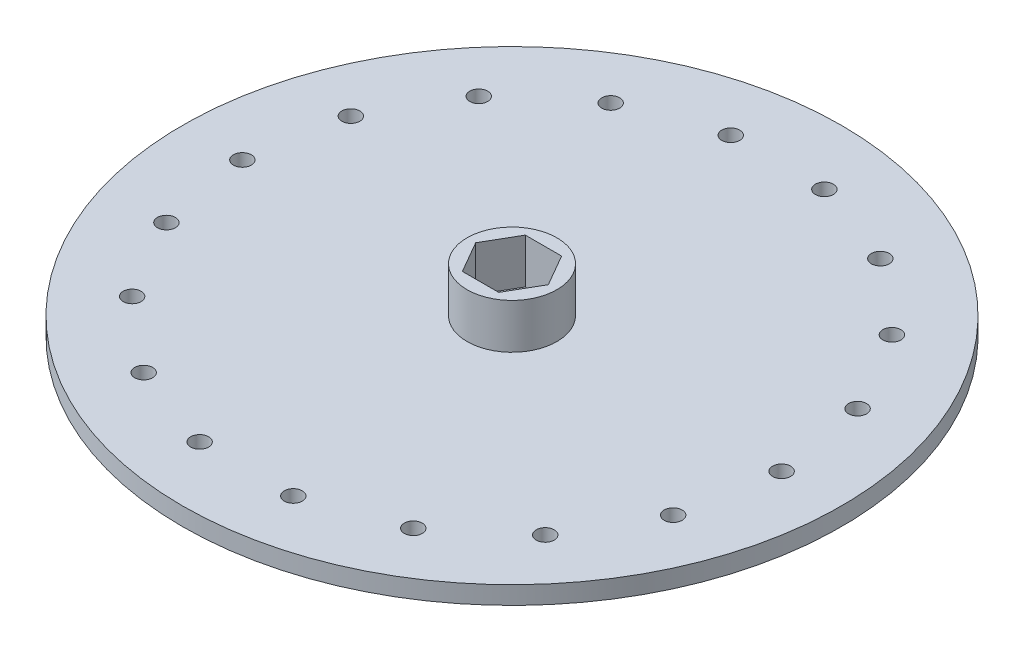
ISO-10303-21;
HEADER;
FILE_DESCRIPTION(('STEP AP214'),'2;1');
FILE_NAME('part.step','',(''),(''),'','','');
FILE_SCHEMA(('AUTOMOTIVE_DESIGN { 1 0 10303 214 1 1 1 1 }'));
ENDSEC;
DATA;
#1=APPLICATION_CONTEXT('core data for automotive mechanical design processes');
#2=APPLICATION_PROTOCOL_DEFINITION('international standard','automotive_design',2000,#1);
#3=PRODUCT_CONTEXT('',#1,'mechanical');
#4=PRODUCT('Part','Part','',(#3));
#5=PRODUCT_RELATED_PRODUCT_CATEGORY('part','',(#4));
#6=PRODUCT_DEFINITION_FORMATION('','',#4);
#7=PRODUCT_DEFINITION_CONTEXT('part definition',#1,'design');
#8=PRODUCT_DEFINITION('design','',#6,#7);
#9=PRODUCT_DEFINITION_SHAPE('','',#8);
#10=(LENGTH_UNIT() NAMED_UNIT(*) SI_UNIT(.MILLI.,.METRE.));
#11=(NAMED_UNIT(*) PLANE_ANGLE_UNIT() SI_UNIT($,.RADIAN.));
#12=(NAMED_UNIT(*) SI_UNIT($,.STERADIAN.) SOLID_ANGLE_UNIT());
#13=UNCERTAINTY_MEASURE_WITH_UNIT(LENGTH_MEASURE(1.E-05),#10,'distance_accuracy_value','');
#14=(GEOMETRIC_REPRESENTATION_CONTEXT(3) GLOBAL_UNCERTAINTY_ASSIGNED_CONTEXT((#13)) GLOBAL_UNIT_ASSIGNED_CONTEXT((#10,
#11,#12)) REPRESENTATION_CONTEXT('',''));
#15=CARTESIAN_POINT('',(0.,0.,0.));
#16=DIRECTION('',(0.,0.,1.));
#17=DIRECTION('',(1.,0.,0.));
#18=AXIS2_PLACEMENT_3D('',#15,#16,#17);
#19=CARTESIAN_POINT('',(0.,6.,0.));
#20=DIRECTION('',(0.,1.,0.));
#21=DIRECTION('',(0.,0.,1.));
#22=AXIS2_PLACEMENT_3D('',#19,#20,#21);
#23=PLANE('',#22);
#24=CARTESIAN_POINT('',(-68.9439998807087,6.,57.8508848717877));
#25=DIRECTION('',(0.,1.,0.));
#26=DIRECTION('',(0.,0.,1.));
#27=AXIS2_PLACEMENT_3D('',#24,#25,#26);
#28=CIRCLE('',#27,3.00000000000001);
#29=CARTESIAN_POINT('',(-68.9439998807087,6.,60.8508848717877));
#30=VERTEX_POINT('',#29);
#31=EDGE_CURVE('E170',#30,#30,#28,.T.);
#32=ORIENTED_EDGE('',*,*,#31,.F.);
#33=EDGE_LOOP('',(#32));
#34=FACE_BOUND('',#33,.T.);
#35=CARTESIAN_POINT('',(-15.6283359900246,6.,88.6326977710986));
#36=DIRECTION('',(0.,1.,0.));
#37=DIRECTION('',(0.,0.,1.));
#38=AXIS2_PLACEMENT_3D('',#35,#36,#37);
#39=CIRCLE('',#38,3.);
#40=CARTESIAN_POINT('',(-15.6283359900246,6.,91.6326977710986));
#41=VERTEX_POINT('',#40);
#42=EDGE_CURVE('E182',#41,#41,#39,.T.);
#43=ORIENTED_EDGE('',*,*,#42,.F.);
#44=EDGE_LOOP('',(#43));
#45=FACE_BOUND('',#44,.T.);
#46=CARTESIAN_POINT('',(44.9999999999993,6.,77.9422863405999));
#47=DIRECTION('',(0.,1.,0.));
#48=DIRECTION('',(0.,0.,1.));
#49=AXIS2_PLACEMENT_3D('',#46,#47,#48);
#50=CIRCLE('',#49,3.);
#51=CARTESIAN_POINT('',(44.9999999999993,6.,80.9422863405999));
#52=VERTEX_POINT('',#51);
#53=EDGE_CURVE('E194',#52,#52,#50,.T.);
#54=ORIENTED_EDGE('',*,*,#53,.F.);
#55=EDGE_LOOP('',(#54));
#56=FACE_BOUND('',#55,.T.);
#57=CARTESIAN_POINT('',(84.5723358707315,6.,30.7818128993108));
#58=DIRECTION('',(0.,1.,0.));
#59=DIRECTION('',(0.,0.,1.));
#60=AXIS2_PLACEMENT_3D('',#57,#58,#59);
#61=CIRCLE('',#60,3.00000000000001);
#62=CARTESIAN_POINT('',(84.5723358707315,6.,33.7818128993108));
#63=VERTEX_POINT('',#62);
#64=EDGE_CURVE('E206',#63,#63,#61,.T.);
#65=ORIENTED_EDGE('',*,*,#64,.F.);
#66=EDGE_LOOP('',(#65));
#67=FACE_BOUND('',#66,.T.);
#68=CARTESIAN_POINT('',(84.572335870732,6.,-30.7818128993097));
#69=DIRECTION('',(0.,1.,0.));
#70=DIRECTION('',(0.,0.,1.));
#71=AXIS2_PLACEMENT_3D('',#68,#69,#70);
#72=CIRCLE('',#71,3.00000000000001);
#73=CARTESIAN_POINT('',(84.572335870732,6.,-27.7818128993097));
#74=VERTEX_POINT('',#73);
#75=EDGE_CURVE('E218',#74,#74,#72,.T.);
#76=ORIENTED_EDGE('',*,*,#75,.F.);
#77=EDGE_LOOP('',(#76));
#78=FACE_BOUND('',#77,.T.);
#79=CARTESIAN_POINT('',(45.0000000000004,6.,-77.9422863405993));
#80=DIRECTION('',(0.,1.,0.));
#81=DIRECTION('',(0.,0.,1.));
#82=AXIS2_PLACEMENT_3D('',#79,#80,#81);
#83=CIRCLE('',#82,3.);
#84=CARTESIAN_POINT('',(45.0000000000004,6.,-74.9422863405993));
#85=VERTEX_POINT('',#84);
#86=EDGE_CURVE('E230',#85,#85,#83,.T.);
#87=ORIENTED_EDGE('',*,*,#86,.F.);
#88=EDGE_LOOP('',(#87));
#89=FACE_BOUND('',#88,.T.);
#90=CARTESIAN_POINT('',(-15.6283359900235,6.,-88.6326977710987));
#91=DIRECTION('',(0.,1.,0.));
#92=DIRECTION('',(0.,0.,1.));
#93=AXIS2_PLACEMENT_3D('',#90,#91,#92);
#94=CIRCLE('',#93,3.);
#95=CARTESIAN_POINT('',(-15.6283359900235,6.,-85.6326977710987));
#96=VERTEX_POINT('',#95);
#97=EDGE_CURVE('E242',#96,#96,#94,.T.);
#98=ORIENTED_EDGE('',*,*,#97,.F.);
#99=EDGE_LOOP('',(#98));
#100=FACE_BOUND('',#99,.T.);
#101=CARTESIAN_POINT('',(-68.943999880708,6.,-57.8508848717887));
#102=DIRECTION('',(0.,1.,0.));
#103=DIRECTION('',(0.,0.,1.));
#104=AXIS2_PLACEMENT_3D('',#101,#102,#103);
#105=CIRCLE('',#104,3.00000000000001);
#106=CARTESIAN_POINT('',(-68.943999880708,6.,-54.8508848717886));
#107=VERTEX_POINT('',#106);
#108=EDGE_CURVE('E254',#107,#107,#105,.T.);
#109=ORIENTED_EDGE('',*,*,#108,.F.);
#110=EDGE_LOOP('',(#109));
#111=FACE_BOUND('',#110,.T.);
#112=CARTESIAN_POINT('',(0.,6.,0.));
#113=DIRECTION('',(0.,1.,0.));
#114=DIRECTION('',(0.,0.,1.));
#115=AXIS2_PLACEMENT_3D('',#112,#113,#114);
#116=CIRCLE('',#115,110.);
#117=CARTESIAN_POINT('',(0.,6.,110.));
#118=VERTEX_POINT('',#117);
#119=EDGE_CURVE('E12',#118,#118,#116,.T.);
#120=ORIENTED_EDGE('',*,*,#119,.T.);
#121=EDGE_LOOP('',(#120));
#122=FACE_BOUND('',#121,.T.);
#123=CARTESIAN_POINT('',(-90.,6.,0.));
#124=DIRECTION('',(0.,1.,0.));
#125=DIRECTION('',(0.,0.,1.));
#126=AXIS2_PLACEMENT_3D('',#123,#124,#125);
#127=CIRCLE('',#126,3.00000000000001);
#128=CARTESIAN_POINT('',(-90.,6.,3.00000000000002));
#129=VERTEX_POINT('',#128);
#130=EDGE_CURVE('E272',#129,#129,#127,.T.);
#131=ORIENTED_EDGE('',*,*,#130,.F.);
#132=EDGE_LOOP('',(#131));
#133=FACE_BOUND('',#132,.T.);
#134=CARTESIAN_POINT('',(-84.5723358707317,6.,-30.7818128993102));
#135=DIRECTION('',(0.,1.,0.));
#136=DIRECTION('',(0.,0.,1.));
#137=AXIS2_PLACEMENT_3D('',#134,#135,#136);
#138=CIRCLE('',#137,3.00000000000001);
#139=CARTESIAN_POINT('',(-84.5723358707317,6.,-27.7818128993102));
#140=VERTEX_POINT('',#139);
#141=EDGE_CURVE('E260',#140,#140,#138,.T.);
#142=ORIENTED_EDGE('',*,*,#141,.F.);
#143=EDGE_LOOP('',(#142));
#144=FACE_BOUND('',#143,.T.);
#145=CARTESIAN_POINT('',(-44.9999999999998,6.,-77.9422863405996));
#146=DIRECTION('',(0.,1.,0.));
#147=DIRECTION('',(0.,0.,1.));
#148=AXIS2_PLACEMENT_3D('',#145,#146,#147);
#149=CIRCLE('',#148,3.);
#150=CARTESIAN_POINT('',(-44.9999999999998,6.,-74.9422863405996));
#151=VERTEX_POINT('',#150);
#152=EDGE_CURVE('E248',#151,#151,#149,.T.);
#153=ORIENTED_EDGE('',*,*,#152,.F.);
#154=EDGE_LOOP('',(#153));
#155=FACE_BOUND('',#154,.T.);
#156=CARTESIAN_POINT('',(15.6283359900241,6.,-88.6326977710987));
#157=DIRECTION('',(0.,1.,0.));
#158=DIRECTION('',(0.,0.,1.));
#159=AXIS2_PLACEMENT_3D('',#156,#157,#158);
#160=CIRCLE('',#159,3.);
#161=CARTESIAN_POINT('',(15.6283359900241,6.,-85.6326977710987));
#162=VERTEX_POINT('',#161);
#163=EDGE_CURVE('E236',#162,#162,#160,.T.);
#164=ORIENTED_EDGE('',*,*,#163,.F.);
#165=EDGE_LOOP('',(#164));
#166=FACE_BOUND('',#165,.T.);
#167=CARTESIAN_POINT('',(68.9439998807083,6.,-57.8508848717882));
#168=DIRECTION('',(0.,1.,0.));
#169=DIRECTION('',(0.,0.,1.));
#170=AXIS2_PLACEMENT_3D('',#167,#168,#169);
#171=CIRCLE('',#170,3.00000000000001);
#172=CARTESIAN_POINT('',(68.9439998807083,6.,-54.8508848717882));
#173=VERTEX_POINT('',#172);
#174=EDGE_CURVE('E224',#173,#173,#171,.T.);
#175=ORIENTED_EDGE('',*,*,#174,.F.);
#176=EDGE_LOOP('',(#175));
#177=FACE_BOUND('',#176,.T.);
#178=CARTESIAN_POINT('',(90.,6.,6.17444819799438E-13));
#179=DIRECTION('',(0.,1.,0.));
#180=DIRECTION('',(0.,0.,1.));
#181=AXIS2_PLACEMENT_3D('',#178,#179,#180);
#182=CIRCLE('',#181,3.00000000000001);
#183=CARTESIAN_POINT('',(90.,6.,3.00000000000063));
#184=VERTEX_POINT('',#183);
#185=EDGE_CURVE('E212',#184,#184,#182,.T.);
#186=ORIENTED_EDGE('',*,*,#185,.F.);
#187=EDGE_LOOP('',(#186));
#188=FACE_BOUND('',#187,.T.);
#189=CARTESIAN_POINT('',(68.9439998807076,6.,57.8508848717891));
#190=DIRECTION('',(0.,1.,0.));
#191=DIRECTION('',(0.,0.,1.));
#192=AXIS2_PLACEMENT_3D('',#189,#190,#191);
#193=CIRCLE('',#192,3.00000000000001);
#194=CARTESIAN_POINT('',(68.9439998807076,6.,60.8508848717891));
#195=VERTEX_POINT('',#194);
#196=EDGE_CURVE('E200',#195,#195,#193,.T.);
#197=ORIENTED_EDGE('',*,*,#196,.F.);
#198=EDGE_LOOP('',(#197));
#199=FACE_BOUND('',#198,.T.);
#200=CARTESIAN_POINT('',(15.6283359900229,6.,88.6326977710989));
#201=DIRECTION('',(0.,1.,0.));
#202=DIRECTION('',(0.,0.,1.));
#203=AXIS2_PLACEMENT_3D('',#200,#201,#202);
#204=CIRCLE('',#203,3.);
#205=CARTESIAN_POINT('',(15.6283359900229,6.,91.6326977710989));
#206=VERTEX_POINT('',#205);
#207=EDGE_CURVE('E188',#206,#206,#204,.T.);
#208=ORIENTED_EDGE('',*,*,#207,.F.);
#209=EDGE_LOOP('',(#208));
#210=FACE_BOUND('',#209,.T.);
#211=CARTESIAN_POINT('',(-45.0000000000009,6.,77.9422863405989));
#212=DIRECTION('',(0.,1.,0.));
#213=DIRECTION('',(0.,0.,1.));
#214=AXIS2_PLACEMENT_3D('',#211,#212,#213);
#215=CIRCLE('',#214,3.);
#216=CARTESIAN_POINT('',(-45.0000000000009,6.,80.9422863405989));
#217=VERTEX_POINT('',#216);
#218=EDGE_CURVE('E176',#217,#217,#215,.T.);
#219=ORIENTED_EDGE('',*,*,#218,.F.);
#220=EDGE_LOOP('',(#219));
#221=FACE_BOUND('',#220,.T.);
#222=CARTESIAN_POINT('',(-84.5723358707321,6.,30.7818128993091));
#223=DIRECTION('',(0.,1.,0.));
#224=DIRECTION('',(0.,0.,1.));
#225=AXIS2_PLACEMENT_3D('',#222,#223,#224);
#226=CIRCLE('',#225,3.00000000000001);
#227=CARTESIAN_POINT('',(-84.5723358707321,6.,33.7818128993091));
#228=VERTEX_POINT('',#227);
#229=EDGE_CURVE('E164',#228,#228,#226,.T.);
#230=ORIENTED_EDGE('',*,*,#229,.F.);
#231=EDGE_LOOP('',(#230));
#232=FACE_BOUND('',#231,.T.);
#233=CARTESIAN_POINT('',(0.,6.,0.));
#234=DIRECTION('',(0.,1.,0.));
#235=DIRECTION('',(0.,0.,1.));
#236=AXIS2_PLACEMENT_3D('',#233,#234,#235);
#237=CIRCLE('',#236,15.);
#238=CARTESIAN_POINT('',(0.,6.,15.));
#239=VERTEX_POINT('',#238);
#240=EDGE_CURVE('E121',#239,#239,#237,.T.);
#241=ORIENTED_EDGE('',*,*,#240,.F.);
#242=EDGE_LOOP('',(#241));
#243=FACE_BOUND('',#242,.T.);
#244=ADVANCED_FACE('F54',(#34,#45,#56,#67,#78,#89,#100,#111,#122,#133,#144,#155,#166,#177,#188,
#199,#210,#221,#232,#243),#23,.T.);
#245=DIRECTION('',(1.,0.,0.));
#246=VECTOR('',#245,1.);
#247=CARTESIAN_POINT('',(-6.06217782649107,6.,10.5));
#248=LINE('',#247,#246);
#249=CARTESIAN_POINT('',(-6.06217782649107,6.,10.5));
#250=VERTEX_POINT('',#249);
#251=CARTESIAN_POINT('',(6.06217782649108,6.,10.5));
#252=VERTEX_POINT('',#251);
#253=EDGE_CURVE('E69',#250,#252,#248,.T.);
#254=ORIENTED_EDGE('',*,*,#253,.T.);
#255=DIRECTION('',(0.5,0.,-0.866025403784438));
#256=VECTOR('',#255,1.);
#257=CARTESIAN_POINT('',(6.06217782649108,6.,10.5));
#258=LINE('',#257,#256);
#259=CARTESIAN_POINT('',(12.1243556529821,6.,0.));
#260=VERTEX_POINT('',#259);
#261=EDGE_CURVE('E73',#252,#260,#258,.T.);
#262=ORIENTED_EDGE('',*,*,#261,.T.);
#263=DIRECTION('',(-0.5,0.,-0.866025403784439));
#264=VECTOR('',#263,1.);
#265=CARTESIAN_POINT('',(12.1243556529821,6.,0.));
#266=LINE('',#265,#264);
#267=CARTESIAN_POINT('',(6.06217782649107,6.,-10.5));
#268=VERTEX_POINT('',#267);
#269=EDGE_CURVE('E140',#260,#268,#266,.T.);
#270=ORIENTED_EDGE('',*,*,#269,.T.);
#271=DIRECTION('',(-1.,0.,0.));
#272=VECTOR('',#271,1.);
#273=CARTESIAN_POINT('',(6.06217782649107,6.,-10.5));
#274=LINE('',#273,#272);
#275=CARTESIAN_POINT('',(-6.06217782649107,6.,-10.5));
#276=VERTEX_POINT('',#275);
#277=EDGE_CURVE('E142',#268,#276,#274,.T.);
#278=ORIENTED_EDGE('',*,*,#277,.T.);
#279=DIRECTION('',(-0.5,0.,0.866025403784438));
#280=VECTOR('',#279,1.);
#281=CARTESIAN_POINT('',(-6.06217782649107,6.,-10.5));
#282=LINE('',#281,#280);
#283=CARTESIAN_POINT('',(-12.1243556529821,6.,0.));
#284=VERTEX_POINT('',#283);
#285=EDGE_CURVE('E144',#276,#284,#282,.T.);
#286=ORIENTED_EDGE('',*,*,#285,.T.);
#287=DIRECTION('',(0.5,0.,0.866025403784439));
#288=VECTOR('',#287,1.);
#289=CARTESIAN_POINT('',(-12.1243556529821,6.,0.));
#290=LINE('',#289,#288);
#291=EDGE_CURVE('E116',#284,#250,#290,.T.);
#292=ORIENTED_EDGE('',*,*,#291,.T.);
#293=EDGE_LOOP('',(#254,#262,#270,#278,#286,#292));
#294=FACE_BOUND('',#293,.T.);
#295=CARTESIAN_POINT('',(0.,6.,0.));
#296=DIRECTION('',(0.,1.,0.));
#297=DIRECTION('',(0.,0.,1.));
#298=AXIS2_PLACEMENT_3D('',#295,#296,#297);
#299=CIRCLE('',#298,7.25);
#300=CARTESIAN_POINT('',(0.,6.,7.25));
#301=VERTEX_POINT('',#300);
#302=EDGE_CURVE('E266',#301,#301,#299,.T.);
#303=ORIENTED_EDGE('',*,*,#302,.F.);
#304=EDGE_LOOP('',(#303));
#305=FACE_BOUND('',#304,.T.);
#306=ADVANCED_FACE('F296',(#294,#305),#23,.T.);
#307=CARTESIAN_POINT('',(0.,0.,0.));
#308=DIRECTION('',(0.,1.,0.));
#309=DIRECTION('',(0.,0.,1.));
#310=AXIS2_PLACEMENT_3D('',#307,#308,#309);
#311=PLANE('',#310);
#312=CARTESIAN_POINT('',(0.,0.,0.));
#313=DIRECTION('',(0.,1.,0.));
#314=DIRECTION('',(0.,0.,1.));
#315=AXIS2_PLACEMENT_3D('',#312,#313,#314);
#316=CIRCLE('',#315,110.);
#317=CARTESIAN_POINT('',(0.,0.,110.));
#318=VERTEX_POINT('',#317);
#319=EDGE_CURVE('E58',#318,#318,#316,.T.);
#320=ORIENTED_EDGE('',*,*,#319,.F.);
#321=EDGE_LOOP('',(#320));
#322=FACE_BOUND('',#321,.T.);
#323=CARTESIAN_POINT('',(-90.,0.,0.));
#324=DIRECTION('',(0.,1.,0.));
#325=DIRECTION('',(0.,0.,1.));
#326=AXIS2_PLACEMENT_3D('',#323,#324,#325);
#327=CIRCLE('',#326,3.00000000000001);
#328=CARTESIAN_POINT('',(-90.,0.,3.00000000000002));
#329=VERTEX_POINT('',#328);
#330=EDGE_CURVE('E269',#329,#329,#327,.T.);
#331=ORIENTED_EDGE('',*,*,#330,.T.);
#332=EDGE_LOOP('',(#331));
#333=FACE_BOUND('',#332,.T.);
#334=CARTESIAN_POINT('',(0.,0.,0.));
#335=DIRECTION('',(0.,1.,0.));
#336=DIRECTION('',(0.,0.,1.));
#337=AXIS2_PLACEMENT_3D('',#334,#335,#336);
#338=CIRCLE('',#337,7.25);
#339=CARTESIAN_POINT('',(0.,0.,7.25));
#340=VERTEX_POINT('',#339);
#341=EDGE_CURVE('E263',#340,#340,#338,.T.);
#342=ORIENTED_EDGE('',*,*,#341,.T.);
#343=EDGE_LOOP('',(#342));
#344=FACE_BOUND('',#343,.T.);
#345=CARTESIAN_POINT('',(-84.5723358707317,0.,-30.7818128993102));
#346=DIRECTION('',(0.,1.,0.));
#347=DIRECTION('',(0.,0.,1.));
#348=AXIS2_PLACEMENT_3D('',#345,#346,#347);
#349=CIRCLE('',#348,3.00000000000001);
#350=CARTESIAN_POINT('',(-84.5723358707317,0.,-27.7818128993102));
#351=VERTEX_POINT('',#350);
#352=EDGE_CURVE('E257',#351,#351,#349,.T.);
#353=ORIENTED_EDGE('',*,*,#352,.T.);
#354=EDGE_LOOP('',(#353));
#355=FACE_BOUND('',#354,.T.);
#356=CARTESIAN_POINT('',(-68.943999880708,0.,-57.8508848717887));
#357=DIRECTION('',(0.,1.,0.));
#358=DIRECTION('',(0.,0.,1.));
#359=AXIS2_PLACEMENT_3D('',#356,#357,#358);
#360=CIRCLE('',#359,3.00000000000001);
#361=CARTESIAN_POINT('',(-68.943999880708,0.,-54.8508848717886));
#362=VERTEX_POINT('',#361);
#363=EDGE_CURVE('E251',#362,#362,#360,.T.);
#364=ORIENTED_EDGE('',*,*,#363,.T.);
#365=EDGE_LOOP('',(#364));
#366=FACE_BOUND('',#365,.T.);
#367=CARTESIAN_POINT('',(-44.9999999999998,0.,-77.9422863405996));
#368=DIRECTION('',(0.,1.,0.));
#369=DIRECTION('',(0.,0.,1.));
#370=AXIS2_PLACEMENT_3D('',#367,#368,#369);
#371=CIRCLE('',#370,3.);
#372=CARTESIAN_POINT('',(-44.9999999999998,0.,-74.9422863405996));
#373=VERTEX_POINT('',#372);
#374=EDGE_CURVE('E245',#373,#373,#371,.T.);
#375=ORIENTED_EDGE('',*,*,#374,.T.);
#376=EDGE_LOOP('',(#375));
#377=FACE_BOUND('',#376,.T.);
#378=CARTESIAN_POINT('',(-15.6283359900235,0.,-88.6326977710987));
#379=DIRECTION('',(0.,1.,0.));
#380=DIRECTION('',(0.,0.,1.));
#381=AXIS2_PLACEMENT_3D('',#378,#379,#380);
#382=CIRCLE('',#381,3.);
#383=CARTESIAN_POINT('',(-15.6283359900235,0.,-85.6326977710987));
#384=VERTEX_POINT('',#383);
#385=EDGE_CURVE('E239',#384,#384,#382,.T.);
#386=ORIENTED_EDGE('',*,*,#385,.T.);
#387=EDGE_LOOP('',(#386));
#388=FACE_BOUND('',#387,.T.);
#389=CARTESIAN_POINT('',(15.6283359900241,0.,-88.6326977710987));
#390=DIRECTION('',(0.,1.,0.));
#391=DIRECTION('',(0.,0.,1.));
#392=AXIS2_PLACEMENT_3D('',#389,#390,#391);
#393=CIRCLE('',#392,3.);
#394=CARTESIAN_POINT('',(15.6283359900241,0.,-85.6326977710987));
#395=VERTEX_POINT('',#394);
#396=EDGE_CURVE('E233',#395,#395,#393,.T.);
#397=ORIENTED_EDGE('',*,*,#396,.T.);
#398=EDGE_LOOP('',(#397));
#399=FACE_BOUND('',#398,.T.);
#400=CARTESIAN_POINT('',(45.0000000000004,0.,-77.9422863405993));
#401=DIRECTION('',(0.,1.,0.));
#402=DIRECTION('',(0.,0.,1.));
#403=AXIS2_PLACEMENT_3D('',#400,#401,#402);
#404=CIRCLE('',#403,3.);
#405=CARTESIAN_POINT('',(45.0000000000004,0.,-74.9422863405993));
#406=VERTEX_POINT('',#405);
#407=EDGE_CURVE('E227',#406,#406,#404,.T.);
#408=ORIENTED_EDGE('',*,*,#407,.T.);
#409=EDGE_LOOP('',(#408));
#410=FACE_BOUND('',#409,.T.);
#411=CARTESIAN_POINT('',(68.9439998807083,0.,-57.8508848717882));
#412=DIRECTION('',(0.,1.,0.));
#413=DIRECTION('',(0.,0.,1.));
#414=AXIS2_PLACEMENT_3D('',#411,#412,#413);
#415=CIRCLE('',#414,3.00000000000001);
#416=CARTESIAN_POINT('',(68.9439998807083,0.,-54.8508848717882));
#417=VERTEX_POINT('',#416);
#418=EDGE_CURVE('E221',#417,#417,#415,.T.);
#419=ORIENTED_EDGE('',*,*,#418,.T.);
#420=EDGE_LOOP('',(#419));
#421=FACE_BOUND('',#420,.T.);
#422=CARTESIAN_POINT('',(84.572335870732,0.,-30.7818128993097));
#423=DIRECTION('',(0.,1.,0.));
#424=DIRECTION('',(0.,0.,1.));
#425=AXIS2_PLACEMENT_3D('',#422,#423,#424);
#426=CIRCLE('',#425,3.00000000000001);
#427=CARTESIAN_POINT('',(84.572335870732,0.,-27.7818128993097));
#428=VERTEX_POINT('',#427);
#429=EDGE_CURVE('E215',#428,#428,#426,.T.);
#430=ORIENTED_EDGE('',*,*,#429,.T.);
#431=EDGE_LOOP('',(#430));
#432=FACE_BOUND('',#431,.T.);
#433=CARTESIAN_POINT('',(90.,0.,6.17444819799438E-13));
#434=DIRECTION('',(0.,1.,0.));
#435=DIRECTION('',(0.,0.,1.));
#436=AXIS2_PLACEMENT_3D('',#433,#434,#435);
#437=CIRCLE('',#436,3.00000000000001);
#438=CARTESIAN_POINT('',(90.,0.,3.00000000000063));
#439=VERTEX_POINT('',#438);
#440=EDGE_CURVE('E209',#439,#439,#437,.T.);
#441=ORIENTED_EDGE('',*,*,#440,.T.);
#442=EDGE_LOOP('',(#441));
#443=FACE_BOUND('',#442,.T.);
#444=CARTESIAN_POINT('',(84.5723358707315,0.,30.7818128993108));
#445=DIRECTION('',(0.,1.,0.));
#446=DIRECTION('',(0.,0.,1.));
#447=AXIS2_PLACEMENT_3D('',#444,#445,#446);
#448=CIRCLE('',#447,3.00000000000001);
#449=CARTESIAN_POINT('',(84.5723358707315,0.,33.7818128993108));
#450=VERTEX_POINT('',#449);
#451=EDGE_CURVE('E203',#450,#450,#448,.T.);
#452=ORIENTED_EDGE('',*,*,#451,.T.);
#453=EDGE_LOOP('',(#452));
#454=FACE_BOUND('',#453,.T.);
#455=CARTESIAN_POINT('',(68.9439998807076,0.,57.8508848717891));
#456=DIRECTION('',(0.,1.,0.));
#457=DIRECTION('',(0.,0.,1.));
#458=AXIS2_PLACEMENT_3D('',#455,#456,#457);
#459=CIRCLE('',#458,3.00000000000001);
#460=CARTESIAN_POINT('',(68.9439998807076,0.,60.8508848717891));
#461=VERTEX_POINT('',#460);
#462=EDGE_CURVE('E197',#461,#461,#459,.T.);
#463=ORIENTED_EDGE('',*,*,#462,.T.);
#464=EDGE_LOOP('',(#463));
#465=FACE_BOUND('',#464,.T.);
#466=CARTESIAN_POINT('',(44.9999999999993,0.,77.9422863405999));
#467=DIRECTION('',(0.,1.,0.));
#468=DIRECTION('',(0.,0.,1.));
#469=AXIS2_PLACEMENT_3D('',#466,#467,#468);
#470=CIRCLE('',#469,3.);
#471=CARTESIAN_POINT('',(44.9999999999993,0.,80.9422863405999));
#472=VERTEX_POINT('',#471);
#473=EDGE_CURVE('E191',#472,#472,#470,.T.);
#474=ORIENTED_EDGE('',*,*,#473,.T.);
#475=EDGE_LOOP('',(#474));
#476=FACE_BOUND('',#475,.T.);
#477=CARTESIAN_POINT('',(15.6283359900229,0.,88.6326977710989));
#478=DIRECTION('',(0.,1.,0.));
#479=DIRECTION('',(0.,0.,1.));
#480=AXIS2_PLACEMENT_3D('',#477,#478,#479);
#481=CIRCLE('',#480,3.);
#482=CARTESIAN_POINT('',(15.6283359900229,0.,91.6326977710989));
#483=VERTEX_POINT('',#482);
#484=EDGE_CURVE('E185',#483,#483,#481,.T.);
#485=ORIENTED_EDGE('',*,*,#484,.T.);
#486=EDGE_LOOP('',(#485));
#487=FACE_BOUND('',#486,.T.);
#488=CARTESIAN_POINT('',(-15.6283359900246,0.,88.6326977710986));
#489=DIRECTION('',(0.,1.,0.));
#490=DIRECTION('',(0.,0.,1.));
#491=AXIS2_PLACEMENT_3D('',#488,#489,#490);
#492=CIRCLE('',#491,3.);
#493=CARTESIAN_POINT('',(-15.6283359900246,0.,91.6326977710986));
#494=VERTEX_POINT('',#493);
#495=EDGE_CURVE('E179',#494,#494,#492,.T.);
#496=ORIENTED_EDGE('',*,*,#495,.T.);
#497=EDGE_LOOP('',(#496));
#498=FACE_BOUND('',#497,.T.);
#499=CARTESIAN_POINT('',(-45.0000000000009,0.,77.9422863405989));
#500=DIRECTION('',(0.,1.,0.));
#501=DIRECTION('',(0.,0.,1.));
#502=AXIS2_PLACEMENT_3D('',#499,#500,#501);
#503=CIRCLE('',#502,3.);
#504=CARTESIAN_POINT('',(-45.0000000000009,0.,80.9422863405989));
#505=VERTEX_POINT('',#504);
#506=EDGE_CURVE('E173',#505,#505,#503,.T.);
#507=ORIENTED_EDGE('',*,*,#506,.T.);
#508=EDGE_LOOP('',(#507));
#509=FACE_BOUND('',#508,.T.);
#510=CARTESIAN_POINT('',(-68.9439998807087,0.,57.8508848717877));
#511=DIRECTION('',(0.,1.,0.));
#512=DIRECTION('',(0.,0.,1.));
#513=AXIS2_PLACEMENT_3D('',#510,#511,#512);
#514=CIRCLE('',#513,3.00000000000001);
#515=CARTESIAN_POINT('',(-68.9439998807087,0.,60.8508848717877));
#516=VERTEX_POINT('',#515);
#517=EDGE_CURVE('E167',#516,#516,#514,.T.);
#518=ORIENTED_EDGE('',*,*,#517,.T.);
#519=EDGE_LOOP('',(#518));
#520=FACE_BOUND('',#519,.T.);
#521=CARTESIAN_POINT('',(-84.5723358707321,0.,30.7818128993091));
#522=DIRECTION('',(0.,1.,0.));
#523=DIRECTION('',(0.,0.,1.));
#524=AXIS2_PLACEMENT_3D('',#521,#522,#523);
#525=CIRCLE('',#524,3.00000000000001);
#526=CARTESIAN_POINT('',(-84.5723358707321,0.,33.7818128993091));
#527=VERTEX_POINT('',#526);
#528=EDGE_CURVE('E161',#527,#527,#525,.T.);
#529=ORIENTED_EDGE('',*,*,#528,.T.);
#530=EDGE_LOOP('',(#529));
#531=FACE_BOUND('',#530,.T.);
#532=ADVANCED_FACE('F278',(#322,#333,#344,#355,#366,#377,#388,#399,#410,#421,#432,#443,#454,
#465,#476,#487,#498,#509,#520,#531),#311,.F.);
#533=CARTESIAN_POINT('',(0.,6.,0.));
#534=DIRECTION('',(0.,-1.,0.));
#535=DIRECTION('',(0.,0.,-1.));
#536=AXIS2_PLACEMENT_3D('',#533,#534,#535);
#537=CYLINDRICAL_SURFACE('',#536,110.);
#538=ORIENTED_EDGE('',*,*,#119,.F.);
#539=EDGE_LOOP('',(#538));
#540=FACE_BOUND('',#539,.T.);
#541=ORIENTED_EDGE('',*,*,#319,.T.);
#542=EDGE_LOOP('',(#541));
#543=FACE_BOUND('',#542,.T.);
#544=ADVANCED_FACE('F56',(#540,#543),#537,.T.);
#545=CARTESIAN_POINT('',(-90.,6.,0.));
#546=DIRECTION('',(0.,-1.,0.));
#547=DIRECTION('',(0.,0.,-1.));
#548=AXIS2_PLACEMENT_3D('',#545,#546,#547);
#549=CYLINDRICAL_SURFACE('',#548,3.00000000000001);
#550=ORIENTED_EDGE('',*,*,#130,.T.);
#551=EDGE_LOOP('',(#550));
#552=FACE_BOUND('',#551,.T.);
#553=ORIENTED_EDGE('',*,*,#330,.F.);
#554=EDGE_LOOP('',(#553));
#555=FACE_BOUND('',#554,.T.);
#556=ADVANCED_FACE('F281',(#552,#555),#549,.F.);
#557=CARTESIAN_POINT('',(0.,6.,0.));
#558=DIRECTION('',(0.,-1.,0.));
#559=DIRECTION('',(0.,0.,-1.));
#560=AXIS2_PLACEMENT_3D('',#557,#558,#559);
#561=CYLINDRICAL_SURFACE('',#560,7.25);
#562=ORIENTED_EDGE('',*,*,#302,.T.);
#563=EDGE_LOOP('',(#562));
#564=FACE_BOUND('',#563,.T.);
#565=ORIENTED_EDGE('',*,*,#341,.F.);
#566=EDGE_LOOP('',(#565));
#567=FACE_BOUND('',#566,.T.);
#568=ADVANCED_FACE('F283',(#564,#567),#561,.F.);
#569=CARTESIAN_POINT('',(-84.5723358707317,6.,-30.7818128993102));
#570=DIRECTION('',(0.,-1.,0.));
#571=DIRECTION('',(0.,0.,-1.));
#572=AXIS2_PLACEMENT_3D('',#569,#570,#571);
#573=CYLINDRICAL_SURFACE('',#572,3.00000000000001);
#574=ORIENTED_EDGE('',*,*,#141,.T.);
#575=EDGE_LOOP('',(#574));
#576=FACE_BOUND('',#575,.T.);
#577=ORIENTED_EDGE('',*,*,#352,.F.);
#578=EDGE_LOOP('',(#577));
#579=FACE_BOUND('',#578,.T.);
#580=ADVANCED_FACE('F290',(#576,#579),#573,.F.);
#581=CARTESIAN_POINT('',(-68.943999880708,6.,-57.8508848717887));
#582=DIRECTION('',(0.,-1.,0.));
#583=DIRECTION('',(0.,0.,-1.));
#584=AXIS2_PLACEMENT_3D('',#581,#582,#583);
#585=CYLINDRICAL_SURFACE('',#584,3.00000000000001);
#586=ORIENTED_EDGE('',*,*,#108,.T.);
#587=EDGE_LOOP('',(#586));
#588=FACE_BOUND('',#587,.T.);
#589=ORIENTED_EDGE('',*,*,#363,.F.);
#590=EDGE_LOOP('',(#589));
#591=FACE_BOUND('',#590,.T.);
#592=ADVANCED_FACE('F335',(#588,#591),#585,.F.);
#593=CARTESIAN_POINT('',(-44.9999999999998,6.,-77.9422863405996));
#594=DIRECTION('',(0.,-1.,0.));
#595=DIRECTION('',(0.,0.,-1.));
#596=AXIS2_PLACEMENT_3D('',#593,#594,#595);
#597=CYLINDRICAL_SURFACE('',#596,3.);
#598=ORIENTED_EDGE('',*,*,#152,.T.);
#599=EDGE_LOOP('',(#598));
#600=FACE_BOUND('',#599,.T.);
#601=ORIENTED_EDGE('',*,*,#374,.F.);
#602=EDGE_LOOP('',(#601));
#603=FACE_BOUND('',#602,.T.);
#604=ADVANCED_FACE('F345',(#600,#603),#597,.F.);
#605=CARTESIAN_POINT('',(-15.6283359900235,6.,-88.6326977710987));
#606=DIRECTION('',(0.,-1.,0.));
#607=DIRECTION('',(0.,0.,-1.));
#608=AXIS2_PLACEMENT_3D('',#605,#606,#607);
#609=CYLINDRICAL_SURFACE('',#608,3.);
#610=ORIENTED_EDGE('',*,*,#97,.T.);
#611=EDGE_LOOP('',(#610));
#612=FACE_BOUND('',#611,.T.);
#613=ORIENTED_EDGE('',*,*,#385,.F.);
#614=EDGE_LOOP('',(#613));
#615=FACE_BOUND('',#614,.T.);
#616=ADVANCED_FACE('F355',(#612,#615),#609,.F.);
#617=CARTESIAN_POINT('',(15.6283359900241,6.,-88.6326977710987));
#618=DIRECTION('',(0.,-1.,0.));
#619=DIRECTION('',(0.,0.,-1.));
#620=AXIS2_PLACEMENT_3D('',#617,#618,#619);
#621=CYLINDRICAL_SURFACE('',#620,3.);
#622=ORIENTED_EDGE('',*,*,#163,.T.);
#623=EDGE_LOOP('',(#622));
#624=FACE_BOUND('',#623,.T.);
#625=ORIENTED_EDGE('',*,*,#396,.F.);
#626=EDGE_LOOP('',(#625));
#627=FACE_BOUND('',#626,.T.);
#628=ADVANCED_FACE('F365',(#624,#627),#621,.F.);
#629=CARTESIAN_POINT('',(45.0000000000004,6.,-77.9422863405993));
#630=DIRECTION('',(0.,-1.,0.));
#631=DIRECTION('',(0.,0.,-1.));
#632=AXIS2_PLACEMENT_3D('',#629,#630,#631);
#633=CYLINDRICAL_SURFACE('',#632,3.);
#634=ORIENTED_EDGE('',*,*,#86,.T.);
#635=EDGE_LOOP('',(#634));
#636=FACE_BOUND('',#635,.T.);
#637=ORIENTED_EDGE('',*,*,#407,.F.);
#638=EDGE_LOOP('',(#637));
#639=FACE_BOUND('',#638,.T.);
#640=ADVANCED_FACE('F375',(#636,#639),#633,.F.);
#641=CARTESIAN_POINT('',(68.9439998807083,6.,-57.8508848717882));
#642=DIRECTION('',(0.,-1.,0.));
#643=DIRECTION('',(0.,0.,-1.));
#644=AXIS2_PLACEMENT_3D('',#641,#642,#643);
#645=CYLINDRICAL_SURFACE('',#644,3.00000000000001);
#646=ORIENTED_EDGE('',*,*,#174,.T.);
#647=EDGE_LOOP('',(#646));
#648=FACE_BOUND('',#647,.T.);
#649=ORIENTED_EDGE('',*,*,#418,.F.);
#650=EDGE_LOOP('',(#649));
#651=FACE_BOUND('',#650,.T.);
#652=ADVANCED_FACE('F385',(#648,#651),#645,.F.);
#653=CARTESIAN_POINT('',(84.572335870732,6.,-30.7818128993097));
#654=DIRECTION('',(0.,-1.,0.));
#655=DIRECTION('',(0.,0.,-1.));
#656=AXIS2_PLACEMENT_3D('',#653,#654,#655);
#657=CYLINDRICAL_SURFACE('',#656,3.00000000000001);
#658=ORIENTED_EDGE('',*,*,#75,.T.);
#659=EDGE_LOOP('',(#658));
#660=FACE_BOUND('',#659,.T.);
#661=ORIENTED_EDGE('',*,*,#429,.F.);
#662=EDGE_LOOP('',(#661));
#663=FACE_BOUND('',#662,.T.);
#664=ADVANCED_FACE('F395',(#660,#663),#657,.F.);
#665=CARTESIAN_POINT('',(90.,6.,6.17444819799438E-13));
#666=DIRECTION('',(0.,-1.,0.));
#667=DIRECTION('',(0.,0.,-1.));
#668=AXIS2_PLACEMENT_3D('',#665,#666,#667);
#669=CYLINDRICAL_SURFACE('',#668,3.00000000000001);
#670=ORIENTED_EDGE('',*,*,#185,.T.);
#671=EDGE_LOOP('',(#670));
#672=FACE_BOUND('',#671,.T.);
#673=ORIENTED_EDGE('',*,*,#440,.F.);
#674=EDGE_LOOP('',(#673));
#675=FACE_BOUND('',#674,.T.);
#676=ADVANCED_FACE('F405',(#672,#675),#669,.F.);
#677=CARTESIAN_POINT('',(84.5723358707315,6.,30.7818128993108));
#678=DIRECTION('',(0.,-1.,0.));
#679=DIRECTION('',(0.,0.,-1.));
#680=AXIS2_PLACEMENT_3D('',#677,#678,#679);
#681=CYLINDRICAL_SURFACE('',#680,3.00000000000001);
#682=ORIENTED_EDGE('',*,*,#64,.T.);
#683=EDGE_LOOP('',(#682));
#684=FACE_BOUND('',#683,.T.);
#685=ORIENTED_EDGE('',*,*,#451,.F.);
#686=EDGE_LOOP('',(#685));
#687=FACE_BOUND('',#686,.T.);
#688=ADVANCED_FACE('F415',(#684,#687),#681,.F.);
#689=CARTESIAN_POINT('',(68.9439998807076,6.,57.8508848717891));
#690=DIRECTION('',(0.,-1.,0.));
#691=DIRECTION('',(0.,0.,-1.));
#692=AXIS2_PLACEMENT_3D('',#689,#690,#691);
#693=CYLINDRICAL_SURFACE('',#692,3.00000000000001);
#694=ORIENTED_EDGE('',*,*,#196,.T.);
#695=EDGE_LOOP('',(#694));
#696=FACE_BOUND('',#695,.T.);
#697=ORIENTED_EDGE('',*,*,#462,.F.);
#698=EDGE_LOOP('',(#697));
#699=FACE_BOUND('',#698,.T.);
#700=ADVANCED_FACE('F425',(#696,#699),#693,.F.);
#701=CARTESIAN_POINT('',(44.9999999999993,6.,77.9422863405999));
#702=DIRECTION('',(0.,-1.,0.));
#703=DIRECTION('',(0.,0.,-1.));
#704=AXIS2_PLACEMENT_3D('',#701,#702,#703);
#705=CYLINDRICAL_SURFACE('',#704,3.);
#706=ORIENTED_EDGE('',*,*,#53,.T.);
#707=EDGE_LOOP('',(#706));
#708=FACE_BOUND('',#707,.T.);
#709=ORIENTED_EDGE('',*,*,#473,.F.);
#710=EDGE_LOOP('',(#709));
#711=FACE_BOUND('',#710,.T.);
#712=ADVANCED_FACE('F435',(#708,#711),#705,.F.);
#713=CARTESIAN_POINT('',(15.6283359900229,6.,88.6326977710989));
#714=DIRECTION('',(0.,-1.,0.));
#715=DIRECTION('',(0.,0.,-1.));
#716=AXIS2_PLACEMENT_3D('',#713,#714,#715);
#717=CYLINDRICAL_SURFACE('',#716,3.);
#718=ORIENTED_EDGE('',*,*,#207,.T.);
#719=EDGE_LOOP('',(#718));
#720=FACE_BOUND('',#719,.T.);
#721=ORIENTED_EDGE('',*,*,#484,.F.);
#722=EDGE_LOOP('',(#721));
#723=FACE_BOUND('',#722,.T.);
#724=ADVANCED_FACE('F445',(#720,#723),#717,.F.);
#725=CARTESIAN_POINT('',(-15.6283359900246,6.,88.6326977710986));
#726=DIRECTION('',(0.,-1.,0.));
#727=DIRECTION('',(0.,0.,-1.));
#728=AXIS2_PLACEMENT_3D('',#725,#726,#727);
#729=CYLINDRICAL_SURFACE('',#728,3.);
#730=ORIENTED_EDGE('',*,*,#42,.T.);
#731=EDGE_LOOP('',(#730));
#732=FACE_BOUND('',#731,.T.);
#733=ORIENTED_EDGE('',*,*,#495,.F.);
#734=EDGE_LOOP('',(#733));
#735=FACE_BOUND('',#734,.T.);
#736=ADVANCED_FACE('F455',(#732,#735),#729,.F.);
#737=CARTESIAN_POINT('',(-45.0000000000009,6.,77.9422863405989));
#738=DIRECTION('',(0.,-1.,0.));
#739=DIRECTION('',(0.,0.,-1.));
#740=AXIS2_PLACEMENT_3D('',#737,#738,#739);
#741=CYLINDRICAL_SURFACE('',#740,3.);
#742=ORIENTED_EDGE('',*,*,#218,.T.);
#743=EDGE_LOOP('',(#742));
#744=FACE_BOUND('',#743,.T.);
#745=ORIENTED_EDGE('',*,*,#506,.F.);
#746=EDGE_LOOP('',(#745));
#747=FACE_BOUND('',#746,.T.);
#748=ADVANCED_FACE('F465',(#744,#747),#741,.F.);
#749=CARTESIAN_POINT('',(-68.9439998807087,6.,57.8508848717877));
#750=DIRECTION('',(0.,-1.,0.));
#751=DIRECTION('',(0.,0.,-1.));
#752=AXIS2_PLACEMENT_3D('',#749,#750,#751);
#753=CYLINDRICAL_SURFACE('',#752,3.00000000000001);
#754=ORIENTED_EDGE('',*,*,#31,.T.);
#755=EDGE_LOOP('',(#754));
#756=FACE_BOUND('',#755,.T.);
#757=ORIENTED_EDGE('',*,*,#517,.F.);
#758=EDGE_LOOP('',(#757));
#759=FACE_BOUND('',#758,.T.);
#760=ADVANCED_FACE('F475',(#756,#759),#753,.F.);
#761=CARTESIAN_POINT('',(-84.5723358707321,6.,30.7818128993091));
#762=DIRECTION('',(0.,-1.,0.));
#763=DIRECTION('',(0.,0.,-1.));
#764=AXIS2_PLACEMENT_3D('',#761,#762,#763);
#765=CYLINDRICAL_SURFACE('',#764,3.00000000000001);
#766=ORIENTED_EDGE('',*,*,#229,.T.);
#767=EDGE_LOOP('',(#766));
#768=FACE_BOUND('',#767,.T.);
#769=ORIENTED_EDGE('',*,*,#528,.F.);
#770=EDGE_LOOP('',(#769));
#771=FACE_BOUND('',#770,.T.);
#772=ADVANCED_FACE('F485',(#768,#771),#765,.F.);
#773=CARTESIAN_POINT('',(0.,21.,0.));
#774=DIRECTION('',(0.,1.,0.));
#775=DIRECTION('',(0.,0.,1.));
#776=AXIS2_PLACEMENT_3D('',#773,#774,#775);
#777=PLANE('',#776);
#778=CARTESIAN_POINT('',(0.,21.,0.));
#779=DIRECTION('',(0.,1.,0.));
#780=DIRECTION('',(0.,0.,1.));
#781=AXIS2_PLACEMENT_3D('',#778,#779,#780);
#782=CIRCLE('',#781,15.);
#783=CARTESIAN_POINT('',(0.,21.,15.));
#784=VERTEX_POINT('',#783);
#785=EDGE_CURVE('E158',#784,#784,#782,.T.);
#786=ORIENTED_EDGE('',*,*,#785,.T.);
#787=EDGE_LOOP('',(#786));
#788=FACE_BOUND('',#787,.T.);
#789=DIRECTION('',(0.5,0.,-0.866025403784438));
#790=VECTOR('',#789,1.);
#791=CARTESIAN_POINT('',(6.06217782649108,21.,10.5));
#792=LINE('',#791,#790);
#793=CARTESIAN_POINT('',(6.06217782649108,21.,10.5));
#794=VERTEX_POINT('',#793);
#795=CARTESIAN_POINT('',(12.1243556529821,21.,0.));
#796=VERTEX_POINT('',#795);
#797=EDGE_CURVE('E115',#794,#796,#792,.T.);
#798=ORIENTED_EDGE('',*,*,#797,.F.);
#799=DIRECTION('',(1.,0.,0.));
#800=VECTOR('',#799,1.);
#801=CARTESIAN_POINT('',(-6.06217782649107,21.,10.5));
#802=LINE('',#801,#800);
#803=CARTESIAN_POINT('',(-6.06217782649107,21.,10.5));
#804=VERTEX_POINT('',#803);
#805=EDGE_CURVE('E106',#804,#794,#802,.T.);
#806=ORIENTED_EDGE('',*,*,#805,.F.);
#807=DIRECTION('',(0.5,0.,0.866025403784439));
#808=VECTOR('',#807,1.);
#809=CARTESIAN_POINT('',(-12.1243556529821,21.,0.));
#810=LINE('',#809,#808);
#811=CARTESIAN_POINT('',(-12.1243556529821,21.,0.));
#812=VERTEX_POINT('',#811);
#813=EDGE_CURVE('E136',#812,#804,#810,.T.);
#814=ORIENTED_EDGE('',*,*,#813,.F.);
#815=DIRECTION('',(-0.5,0.,0.866025403784438));
#816=VECTOR('',#815,1.);
#817=CARTESIAN_POINT('',(-6.06217782649107,21.,-10.5));
#818=LINE('',#817,#816);
#819=CARTESIAN_POINT('',(-6.06217782649107,21.,-10.5));
#820=VERTEX_POINT('',#819);
#821=EDGE_CURVE('E133',#820,#812,#818,.T.);
#822=ORIENTED_EDGE('',*,*,#821,.F.);
#823=DIRECTION('',(-1.,0.,0.));
#824=VECTOR('',#823,1.);
#825=CARTESIAN_POINT('',(6.06217782649107,21.,-10.5));
#826=LINE('',#825,#824);
#827=CARTESIAN_POINT('',(6.06217782649107,21.,-10.5));
#828=VERTEX_POINT('',#827);
#829=EDGE_CURVE('E129',#828,#820,#826,.T.);
#830=ORIENTED_EDGE('',*,*,#829,.F.);
#831=DIRECTION('',(-0.5,0.,-0.866025403784439));
#832=VECTOR('',#831,1.);
#833=CARTESIAN_POINT('',(12.1243556529821,21.,0.));
#834=LINE('',#833,#832);
#835=EDGE_CURVE('E127',#796,#828,#834,.T.);
#836=ORIENTED_EDGE('',*,*,#835,.F.);
#837=EDGE_LOOP('',(#798,#806,#814,#822,#830,#836));
#838=FACE_BOUND('',#837,.T.);
#839=ADVANCED_FACE('F125',(#788,#838),#777,.T.);
#840=CARTESIAN_POINT('',(0.,21.,0.));
#841=DIRECTION('',(0.,-1.,0.));
#842=DIRECTION('',(0.,0.,-1.));
#843=AXIS2_PLACEMENT_3D('',#840,#841,#842);
#844=CYLINDRICAL_SURFACE('',#843,15.);
#845=ORIENTED_EDGE('',*,*,#785,.F.);
#846=EDGE_LOOP('',(#845));
#847=FACE_BOUND('',#846,.T.);
#848=ORIENTED_EDGE('',*,*,#240,.T.);
#849=EDGE_LOOP('',(#848));
#850=FACE_BOUND('',#849,.T.);
#851=ADVANCED_FACE('F512',(#847,#850),#844,.T.);
#852=CARTESIAN_POINT('',(-6.06217782649107,21.,10.5));
#853=DIRECTION('',(0.,0.,-1.));
#854=DIRECTION('',(-1.,0.,0.));
#855=AXIS2_PLACEMENT_3D('',#852,#853,#854);
#856=PLANE('',#855);
#857=ORIENTED_EDGE('',*,*,#253,.F.);
#858=DIRECTION('',(0.,-1.,0.));
#859=VECTOR('',#858,1.);
#860=CARTESIAN_POINT('',(-6.06217782649107,21.,10.5));
#861=LINE('',#860,#859);
#862=EDGE_CURVE('E111',#804,#250,#861,.T.);
#863=ORIENTED_EDGE('',*,*,#862,.F.);
#864=ORIENTED_EDGE('',*,*,#805,.T.);
#865=DIRECTION('',(0.,-1.,0.));
#866=VECTOR('',#865,1.);
#867=CARTESIAN_POINT('',(6.06217782649108,21.,10.5));
#868=LINE('',#867,#866);
#869=EDGE_CURVE('E109',#794,#252,#868,.T.);
#870=ORIENTED_EDGE('',*,*,#869,.T.);
#871=EDGE_LOOP('',(#857,#863,#864,#870));
#872=FACE_BOUND('',#871,.T.);
#873=ADVANCED_FACE('F108',(#872),#856,.T.);
#874=CARTESIAN_POINT('',(6.06217782649108,21.,10.5));
#875=DIRECTION('',(-0.866025403784438,0.,-0.5));
#876=DIRECTION('',(-0.5,0.,0.866025403784439));
#877=AXIS2_PLACEMENT_3D('',#874,#875,#876);
#878=PLANE('',#877);
#879=ORIENTED_EDGE('',*,*,#261,.F.);
#880=ORIENTED_EDGE('',*,*,#869,.F.);
#881=ORIENTED_EDGE('',*,*,#797,.T.);
#882=DIRECTION('',(0.,-1.,0.));
#883=VECTOR('',#882,1.);
#884=CARTESIAN_POINT('',(12.1243556529821,21.,0.));
#885=LINE('',#884,#883);
#886=EDGE_CURVE('E122',#796,#260,#885,.T.);
#887=ORIENTED_EDGE('',*,*,#886,.T.);
#888=EDGE_LOOP('',(#879,#880,#881,#887));
#889=FACE_BOUND('',#888,.T.);
#890=ADVANCED_FACE('F119',(#889),#878,.T.);
#891=CARTESIAN_POINT('',(12.1243556529821,21.,0.));
#892=DIRECTION('',(-0.866025403784439,0.,0.5));
#893=DIRECTION('',(0.5,0.,0.866025403784439));
#894=AXIS2_PLACEMENT_3D('',#891,#892,#893);
#895=PLANE('',#894);
#896=ORIENTED_EDGE('',*,*,#269,.F.);
#897=ORIENTED_EDGE('',*,*,#886,.F.);
#898=ORIENTED_EDGE('',*,*,#835,.T.);
#899=DIRECTION('',(0.,-1.,0.));
#900=VECTOR('',#899,1.);
#901=CARTESIAN_POINT('',(6.06217782649107,21.,-10.5));
#902=LINE('',#901,#900);
#903=EDGE_CURVE('E154',#828,#268,#902,.T.);
#904=ORIENTED_EDGE('',*,*,#903,.T.);
#905=EDGE_LOOP('',(#896,#897,#898,#904));
#906=FACE_BOUND('',#905,.T.);
#907=ADVANCED_FACE('F539',(#906),#895,.T.);
#908=CARTESIAN_POINT('',(6.06217782649107,21.,-10.5));
#909=DIRECTION('',(0.,0.,1.));
#910=DIRECTION('',(1.,0.,0.));
#911=AXIS2_PLACEMENT_3D('',#908,#909,#910);
#912=PLANE('',#911);
#913=ORIENTED_EDGE('',*,*,#277,.F.);
#914=ORIENTED_EDGE('',*,*,#903,.F.);
#915=ORIENTED_EDGE('',*,*,#829,.T.);
#916=DIRECTION('',(0.,-1.,0.));
#917=VECTOR('',#916,1.);
#918=CARTESIAN_POINT('',(-6.06217782649107,21.,-10.5));
#919=LINE('',#918,#917);
#920=EDGE_CURVE('E151',#820,#276,#919,.T.);
#921=ORIENTED_EDGE('',*,*,#920,.T.);
#922=EDGE_LOOP('',(#913,#914,#915,#921));
#923=FACE_BOUND('',#922,.T.);
#924=ADVANCED_FACE('F548',(#923),#912,.T.);
#925=CARTESIAN_POINT('',(-6.06217782649107,21.,-10.5));
#926=DIRECTION('',(0.866025403784438,0.,0.5));
#927=DIRECTION('',(0.5,0.,-0.866025403784439));
#928=AXIS2_PLACEMENT_3D('',#925,#926,#927);
#929=PLANE('',#928);
#930=ORIENTED_EDGE('',*,*,#285,.F.);
#931=ORIENTED_EDGE('',*,*,#920,.F.);
#932=ORIENTED_EDGE('',*,*,#821,.T.);
#933=DIRECTION('',(0.,-1.,0.));
#934=VECTOR('',#933,1.);
#935=CARTESIAN_POINT('',(-12.1243556529821,21.,0.));
#936=LINE('',#935,#934);
#937=EDGE_CURVE('E148',#812,#284,#936,.T.);
#938=ORIENTED_EDGE('',*,*,#937,.T.);
#939=EDGE_LOOP('',(#930,#931,#932,#938));
#940=FACE_BOUND('',#939,.T.);
#941=ADVANCED_FACE('F558',(#940),#929,.T.);
#942=CARTESIAN_POINT('',(-12.1243556529821,21.,0.));
#943=DIRECTION('',(0.866025403784439,0.,-0.5));
#944=DIRECTION('',(-0.5,0.,-0.866025403784439));
#945=AXIS2_PLACEMENT_3D('',#942,#943,#944);
#946=PLANE('',#945);
#947=ORIENTED_EDGE('',*,*,#291,.F.);
#948=ORIENTED_EDGE('',*,*,#937,.F.);
#949=ORIENTED_EDGE('',*,*,#813,.T.);
#950=ORIENTED_EDGE('',*,*,#862,.T.);
#951=EDGE_LOOP('',(#947,#948,#949,#950));
#952=FACE_BOUND('',#951,.T.);
#953=ADVANCED_FACE('F568',(#952),#946,.T.);
#954=CLOSED_SHELL('',(#244,#306,#532,#544,#556,#568,#580,#592,#604,#616,#628,#640,#652,#664,
#676,#688,#700,#712,#724,#736,#748,#760,#772,#839,#851,#873,#890,#907,#924,#941,#953));
#955=MANIFOLD_SOLID_BREP('B2',#954);
#956=ADVANCED_BREP_SHAPE_REPRESENTATION('',(#18,#955),#14);
#957=SHAPE_DEFINITION_REPRESENTATION(#9,#956);
ENDSEC;
END-ISO-10303-21;
